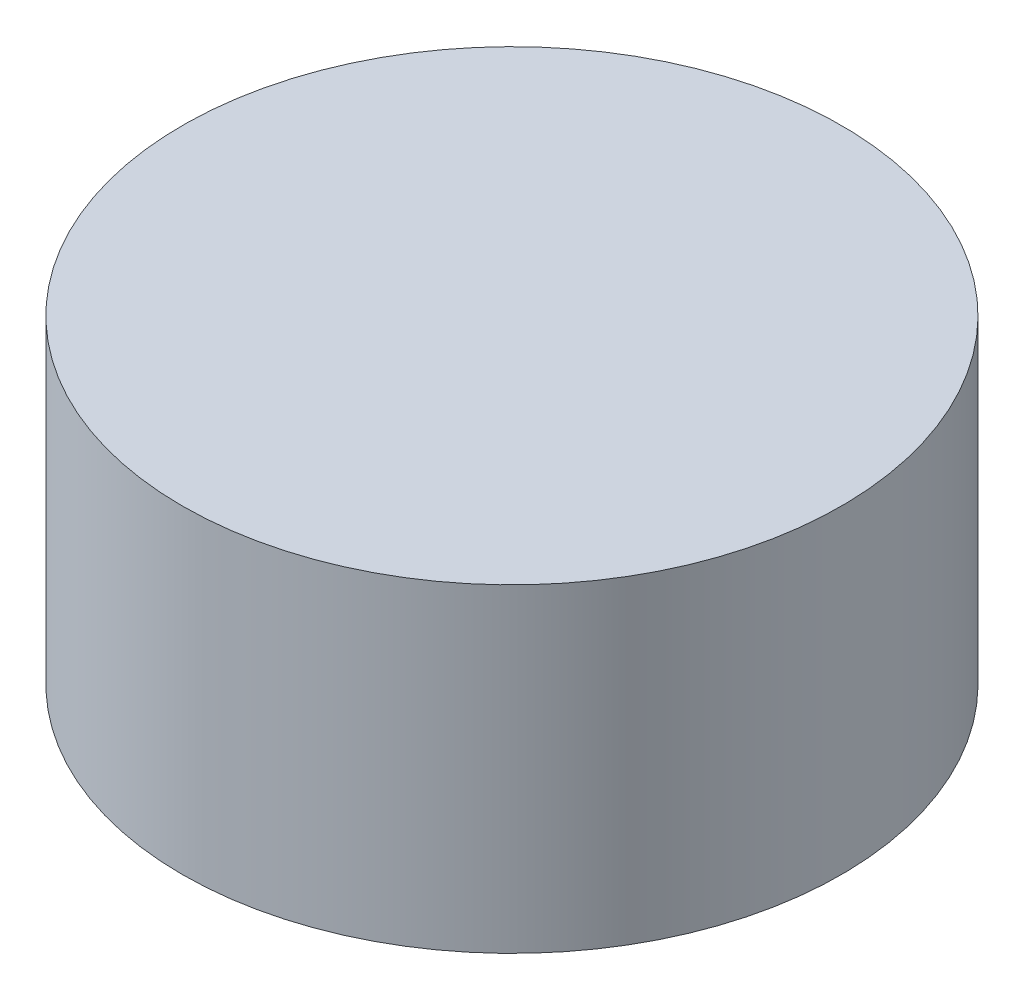
ISO-10303-21;
HEADER;
FILE_DESCRIPTION(('STEP AP214'),'2;1');
FILE_NAME('part.step','',(''),(''),'','','');
FILE_SCHEMA(('AUTOMOTIVE_DESIGN { 1 0 10303 214 1 1 1 1 }'));
ENDSEC;
DATA;
#1=APPLICATION_CONTEXT('core data for automotive mechanical design processes');
#2=APPLICATION_PROTOCOL_DEFINITION('international standard','automotive_design',2000,#1);
#3=PRODUCT_CONTEXT('',#1,'mechanical');
#4=PRODUCT('Part','Part','',(#3));
#5=PRODUCT_RELATED_PRODUCT_CATEGORY('part','',(#4));
#6=PRODUCT_DEFINITION_FORMATION('','',#4);
#7=PRODUCT_DEFINITION_CONTEXT('part definition',#1,'design');
#8=PRODUCT_DEFINITION('design','',#6,#7);
#9=PRODUCT_DEFINITION_SHAPE('','',#8);
#10=(LENGTH_UNIT() NAMED_UNIT(*) SI_UNIT(.MILLI.,.METRE.));
#11=(NAMED_UNIT(*) PLANE_ANGLE_UNIT() SI_UNIT($,.RADIAN.));
#12=(NAMED_UNIT(*) SI_UNIT($,.STERADIAN.) SOLID_ANGLE_UNIT());
#13=UNCERTAINTY_MEASURE_WITH_UNIT(LENGTH_MEASURE(1.E-05),#10,'distance_accuracy_value','');
#14=(GEOMETRIC_REPRESENTATION_CONTEXT(3) GLOBAL_UNCERTAINTY_ASSIGNED_CONTEXT((#13)) GLOBAL_UNIT_ASSIGNED_CONTEXT((#10,
#11,#12)) REPRESENTATION_CONTEXT('',''));
#15=CARTESIAN_POINT('',(0.,0.,0.));
#16=DIRECTION('',(0.,0.,1.));
#17=DIRECTION('',(1.,0.,0.));
#18=AXIS2_PLACEMENT_3D('',#15,#16,#17);
#19=CARTESIAN_POINT('',(0.,10.,0.));
#20=DIRECTION('',(0.,-1.,0.));
#21=DIRECTION('',(0.,0.,-1.));
#22=AXIS2_PLACEMENT_3D('',#19,#20,#21);
#23=CYLINDRICAL_SURFACE('',#22,10.325);
#24=CARTESIAN_POINT('',(0.,10.,0.));
#25=DIRECTION('',(0.,1.,0.));
#26=DIRECTION('',(0.,0.,1.));
#27=AXIS2_PLACEMENT_3D('',#24,#25,#26);
#28=CIRCLE('',#27,10.325);
#29=CARTESIAN_POINT('',(0.,10.,10.325));
#30=VERTEX_POINT('',#29);
#31=EDGE_CURVE('E10',#30,#30,#28,.T.);
#32=ORIENTED_EDGE('',*,*,#31,.F.);
#33=EDGE_LOOP('',(#32));
#34=FACE_BOUND('',#33,.T.);
#35=CARTESIAN_POINT('',(0.,0.,0.));
#36=DIRECTION('',(0.,1.,0.));
#37=DIRECTION('',(0.,0.,1.));
#38=AXIS2_PLACEMENT_3D('',#35,#36,#37);
#39=CIRCLE('',#38,10.325);
#40=CARTESIAN_POINT('',(0.,0.,10.325));
#41=VERTEX_POINT('',#40);
#42=EDGE_CURVE('E34',#41,#41,#39,.T.);
#43=ORIENTED_EDGE('',*,*,#42,.T.);
#44=EDGE_LOOP('',(#43));
#45=FACE_BOUND('',#44,.T.);
#46=ADVANCED_FACE('F31',(#34,#45),#23,.T.);
#47=CARTESIAN_POINT('',(0.,10.,0.));
#48=DIRECTION('',(0.,1.,0.));
#49=DIRECTION('',(0.,0.,1.));
#50=AXIS2_PLACEMENT_3D('',#47,#48,#49);
#51=PLANE('',#50);
#52=ORIENTED_EDGE('',*,*,#31,.T.);
#53=EDGE_LOOP('',(#52));
#54=FACE_BOUND('',#53,.T.);
#55=ADVANCED_FACE('F46',(#54),#51,.T.);
#56=CARTESIAN_POINT('',(0.,0.,0.));
#57=DIRECTION('',(0.,1.,0.));
#58=DIRECTION('',(0.,0.,1.));
#59=AXIS2_PLACEMENT_3D('',#56,#57,#58);
#60=PLANE('',#59);
#61=ORIENTED_EDGE('',*,*,#42,.F.);
#62=EDGE_LOOP('',(#61));
#63=FACE_BOUND('',#62,.T.);
#64=ADVANCED_FACE('F44',(#63),#60,.F.);
#65=CLOSED_SHELL('',(#46,#55,#64));
#66=MANIFOLD_SOLID_BREP('B2',#65);
#67=ADVANCED_BREP_SHAPE_REPRESENTATION('',(#18,#66),#14);
#68=SHAPE_DEFINITION_REPRESENTATION(#9,#67);
ENDSEC;
END-ISO-10303-21;
